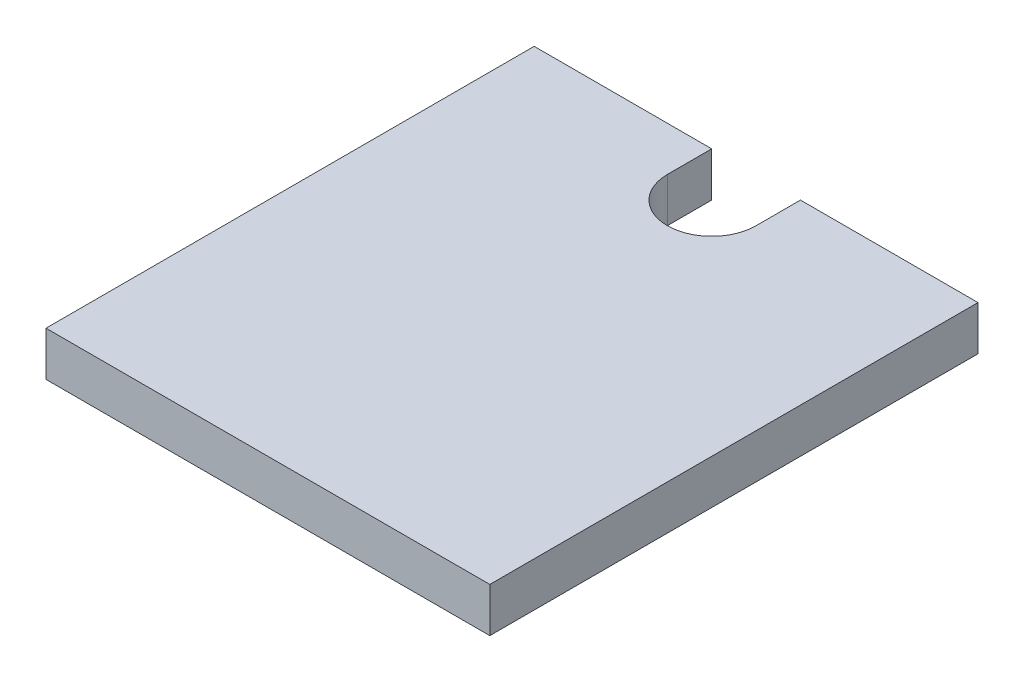
ISO-10303-21;
HEADER;
FILE_DESCRIPTION(('STEP AP214'),'2;1');
FILE_NAME('part.step','',(''),(''),'','','');
FILE_SCHEMA(('AUTOMOTIVE_DESIGN { 1 0 10303 214 1 1 1 1 }'));
ENDSEC;
DATA;
#1=APPLICATION_CONTEXT('core data for automotive mechanical design processes');
#2=APPLICATION_PROTOCOL_DEFINITION('international standard','automotive_design',2000,#1);
#3=PRODUCT_CONTEXT('',#1,'mechanical');
#4=PRODUCT('Part','Part','',(#3));
#5=PRODUCT_RELATED_PRODUCT_CATEGORY('part','',(#4));
#6=PRODUCT_DEFINITION_FORMATION('','',#4);
#7=PRODUCT_DEFINITION_CONTEXT('part definition',#1,'design');
#8=PRODUCT_DEFINITION('design','',#6,#7);
#9=PRODUCT_DEFINITION_SHAPE('','',#8);
#10=(LENGTH_UNIT() NAMED_UNIT(*) SI_UNIT(.MILLI.,.METRE.));
#11=(NAMED_UNIT(*) PLANE_ANGLE_UNIT() SI_UNIT($,.RADIAN.));
#12=(NAMED_UNIT(*) SI_UNIT($,.STERADIAN.) SOLID_ANGLE_UNIT());
#13=UNCERTAINTY_MEASURE_WITH_UNIT(LENGTH_MEASURE(1.E-05),#10,'distance_accuracy_value','');
#14=(GEOMETRIC_REPRESENTATION_CONTEXT(3) GLOBAL_UNCERTAINTY_ASSIGNED_CONTEXT((#13)) GLOBAL_UNIT_ASSIGNED_CONTEXT((#10,
#11,#12)) REPRESENTATION_CONTEXT('',''));
#15=CARTESIAN_POINT('',(0.,0.,0.));
#16=DIRECTION('',(0.,0.,1.));
#17=DIRECTION('',(1.,0.,0.));
#18=AXIS2_PLACEMENT_3D('',#15,#16,#17);
#19=CARTESIAN_POINT('',(25.,5.,-27.5));
#20=DIRECTION('',(-1.,0.,0.));
#21=DIRECTION('',(0.,0.,1.));
#22=AXIS2_PLACEMENT_3D('',#19,#20,#21);
#23=PLANE('',#22);
#24=DIRECTION('',(0.,0.,-1.));
#25=VECTOR('',#24,1.);
#26=CARTESIAN_POINT('',(25.,0.,-27.5));
#27=LINE('',#26,#25);
#28=CARTESIAN_POINT('',(25.,0.,27.5));
#29=VERTEX_POINT('',#28);
#30=CARTESIAN_POINT('',(25.,0.,-27.5));
#31=VERTEX_POINT('',#30);
#32=EDGE_CURVE('E129',#29,#31,#27,.T.);
#33=ORIENTED_EDGE('',*,*,#32,.T.);
#34=DIRECTION('',(0.,-1.,0.));
#35=VECTOR('',#34,1.);
#36=CARTESIAN_POINT('',(25.,5.,-27.5));
#37=LINE('',#36,#35);
#38=CARTESIAN_POINT('',(25.,5.,-27.5));
#39=VERTEX_POINT('',#38);
#40=EDGE_CURVE('E11',#39,#31,#37,.T.);
#41=ORIENTED_EDGE('',*,*,#40,.F.);
#42=DIRECTION('',(0.,0.,-1.));
#43=VECTOR('',#42,1.);
#44=CARTESIAN_POINT('',(25.,5.,-27.5));
#45=LINE('',#44,#43);
#46=CARTESIAN_POINT('',(25.,5.,27.5));
#47=VERTEX_POINT('',#46);
#48=EDGE_CURVE('E143',#47,#39,#45,.T.);
#49=ORIENTED_EDGE('',*,*,#48,.F.);
#50=DIRECTION('',(0.,-1.,0.));
#51=VECTOR('',#50,1.);
#52=CARTESIAN_POINT('',(25.,5.,27.5));
#53=LINE('',#52,#51);
#54=EDGE_CURVE('E125',#47,#29,#53,.T.);
#55=ORIENTED_EDGE('',*,*,#54,.T.);
#56=EDGE_LOOP('',(#33,#41,#49,#55));
#57=FACE_BOUND('',#56,.T.);
#58=ADVANCED_FACE('F33',(#57),#23,.F.);
#59=CARTESIAN_POINT('',(5.,5.,-27.5));
#60=DIRECTION('',(0.,0.,1.));
#61=DIRECTION('',(1.,0.,0.));
#62=AXIS2_PLACEMENT_3D('',#59,#60,#61);
#63=PLANE('',#62);
#64=DIRECTION('',(-1.,0.,0.));
#65=VECTOR('',#64,1.);
#66=CARTESIAN_POINT('',(5.,0.,-27.5));
#67=LINE('',#66,#65);
#68=CARTESIAN_POINT('',(5.,0.,-27.5));
#69=VERTEX_POINT('',#68);
#70=EDGE_CURVE('E132',#31,#69,#67,.T.);
#71=ORIENTED_EDGE('',*,*,#70,.T.);
#72=DIRECTION('',(0.,-1.,0.));
#73=VECTOR('',#72,1.);
#74=CARTESIAN_POINT('',(5.,5.,-27.5));
#75=LINE('',#74,#73);
#76=CARTESIAN_POINT('',(5.,5.,-27.5));
#77=VERTEX_POINT('',#76);
#78=EDGE_CURVE('E41',#77,#69,#75,.T.);
#79=ORIENTED_EDGE('',*,*,#78,.F.);
#80=DIRECTION('',(-1.,0.,0.));
#81=VECTOR('',#80,1.);
#82=CARTESIAN_POINT('',(5.,5.,-27.5));
#83=LINE('',#82,#81);
#84=EDGE_CURVE('E92',#39,#77,#83,.T.);
#85=ORIENTED_EDGE('',*,*,#84,.F.);
#86=ORIENTED_EDGE('',*,*,#40,.T.);
#87=EDGE_LOOP('',(#71,#79,#85,#86));
#88=FACE_BOUND('',#87,.T.);
#89=ADVANCED_FACE('F178',(#88),#63,.F.);
#90=CARTESIAN_POINT('',(5.,5.,-22.5));
#91=DIRECTION('',(1.,0.,0.));
#92=DIRECTION('',(0.,0.,-1.));
#93=AXIS2_PLACEMENT_3D('',#90,#91,#92);
#94=PLANE('',#93);
#95=DIRECTION('',(0.,0.,1.));
#96=VECTOR('',#95,1.);
#97=CARTESIAN_POINT('',(5.,0.,-22.5));
#98=LINE('',#97,#96);
#99=CARTESIAN_POINT('',(5.,0.,-22.5));
#100=VERTEX_POINT('',#99);
#101=EDGE_CURVE('E134',#69,#100,#98,.T.);
#102=ORIENTED_EDGE('',*,*,#101,.T.);
#103=DIRECTION('',(0.,-1.,0.));
#104=VECTOR('',#103,1.);
#105=CARTESIAN_POINT('',(5.,5.,-22.5));
#106=LINE('',#105,#104);
#107=CARTESIAN_POINT('',(5.,5.,-22.5));
#108=VERTEX_POINT('',#107);
#109=EDGE_CURVE('E150',#108,#100,#106,.T.);
#110=ORIENTED_EDGE('',*,*,#109,.F.);
#111=DIRECTION('',(0.,0.,1.));
#112=VECTOR('',#111,1.);
#113=CARTESIAN_POINT('',(5.,5.,-22.5));
#114=LINE('',#113,#112);
#115=EDGE_CURVE('E158',#77,#108,#114,.T.);
#116=ORIENTED_EDGE('',*,*,#115,.F.);
#117=ORIENTED_EDGE('',*,*,#78,.T.);
#118=EDGE_LOOP('',(#102,#110,#116,#117));
#119=FACE_BOUND('',#118,.T.);
#120=ADVANCED_FACE('F156',(#119),#94,.F.);
#121=CARTESIAN_POINT('',(0.,5.,-22.5));
#122=DIRECTION('',(0.,-1.,0.));
#123=DIRECTION('',(0.,0.,-1.));
#124=AXIS2_PLACEMENT_3D('',#121,#122,#123);
#125=CYLINDRICAL_SURFACE('',#124,5.);
#126=CARTESIAN_POINT('',(0.,0.,-22.5));
#127=DIRECTION('',(0.,-1.,0.));
#128=DIRECTION('',(0.,0.,-1.));
#129=AXIS2_PLACEMENT_3D('',#126,#127,#128);
#130=CIRCLE('',#129,5.);
#131=CARTESIAN_POINT('',(-5.,0.,-22.5));
#132=VERTEX_POINT('',#131);
#133=EDGE_CURVE('E136',#100,#132,#130,.T.);
#134=ORIENTED_EDGE('',*,*,#133,.T.);
#135=DIRECTION('',(0.,-1.,0.));
#136=VECTOR('',#135,1.);
#137=CARTESIAN_POINT('',(-5.,5.,-22.5));
#138=LINE('',#137,#136);
#139=CARTESIAN_POINT('',(-5.,5.,-22.5));
#140=VERTEX_POINT('',#139);
#141=EDGE_CURVE('E147',#140,#132,#138,.T.);
#142=ORIENTED_EDGE('',*,*,#141,.F.);
#143=CARTESIAN_POINT('',(0.,5.,-22.5));
#144=DIRECTION('',(0.,-1.,0.));
#145=DIRECTION('',(0.,0.,-1.));
#146=AXIS2_PLACEMENT_3D('',#143,#144,#145);
#147=CIRCLE('',#146,5.);
#148=EDGE_CURVE('E170',#108,#140,#147,.T.);
#149=ORIENTED_EDGE('',*,*,#148,.F.);
#150=ORIENTED_EDGE('',*,*,#109,.T.);
#151=EDGE_LOOP('',(#134,#142,#149,#150));
#152=FACE_BOUND('',#151,.T.);
#153=ADVANCED_FACE('F166',(#152),#125,.F.);
#154=CARTESIAN_POINT('',(-5.,5.,-22.5));
#155=DIRECTION('',(-1.,0.,0.));
#156=DIRECTION('',(0.,0.,1.));
#157=AXIS2_PLACEMENT_3D('',#154,#155,#156);
#158=PLANE('',#157);
#159=DIRECTION('',(0.,0.,-1.));
#160=VECTOR('',#159,1.);
#161=CARTESIAN_POINT('',(-5.,0.,-22.5));
#162=LINE('',#161,#160);
#163=CARTESIAN_POINT('',(-5.,0.,-27.5));
#164=VERTEX_POINT('',#163);
#165=EDGE_CURVE('E138',#132,#164,#162,.T.);
#166=ORIENTED_EDGE('',*,*,#165,.T.);
#167=DIRECTION('',(0.,-1.,0.));
#168=VECTOR('',#167,1.);
#169=CARTESIAN_POINT('',(-5.,5.,-27.5));
#170=LINE('',#169,#168);
#171=CARTESIAN_POINT('',(-5.,5.,-27.5));
#172=VERTEX_POINT('',#171);
#173=EDGE_CURVE('E120',#172,#164,#170,.T.);
#174=ORIENTED_EDGE('',*,*,#173,.F.);
#175=DIRECTION('',(0.,0.,-1.));
#176=VECTOR('',#175,1.);
#177=CARTESIAN_POINT('',(-5.,5.,-22.5));
#178=LINE('',#177,#176);
#179=EDGE_CURVE('E111',#140,#172,#178,.T.);
#180=ORIENTED_EDGE('',*,*,#179,.F.);
#181=ORIENTED_EDGE('',*,*,#141,.T.);
#182=EDGE_LOOP('',(#166,#174,#180,#181));
#183=FACE_BOUND('',#182,.T.);
#184=ADVANCED_FACE('F169',(#183),#158,.F.);
#185=CARTESIAN_POINT('',(-25.,5.,-27.5));
#186=DIRECTION('',(0.,0.,1.));
#187=DIRECTION('',(1.,0.,0.));
#188=AXIS2_PLACEMENT_3D('',#185,#186,#187);
#189=PLANE('',#188);
#190=DIRECTION('',(-1.,0.,0.));
#191=VECTOR('',#190,1.);
#192=CARTESIAN_POINT('',(-25.,0.,-27.5));
#193=LINE('',#192,#191);
#194=CARTESIAN_POINT('',(-25.,0.,-27.5));
#195=VERTEX_POINT('',#194);
#196=EDGE_CURVE('E119',#164,#195,#193,.T.);
#197=ORIENTED_EDGE('',*,*,#196,.T.);
#198=DIRECTION('',(0.,-1.,0.));
#199=VECTOR('',#198,1.);
#200=CARTESIAN_POINT('',(-25.,5.,-27.5));
#201=LINE('',#200,#199);
#202=CARTESIAN_POINT('',(-25.,5.,-27.5));
#203=VERTEX_POINT('',#202);
#204=EDGE_CURVE('E116',#203,#195,#201,.T.);
#205=ORIENTED_EDGE('',*,*,#204,.F.);
#206=DIRECTION('',(-1.,0.,0.));
#207=VECTOR('',#206,1.);
#208=CARTESIAN_POINT('',(-25.,5.,-27.5));
#209=LINE('',#208,#207);
#210=EDGE_CURVE('E105',#172,#203,#209,.T.);
#211=ORIENTED_EDGE('',*,*,#210,.F.);
#212=ORIENTED_EDGE('',*,*,#173,.T.);
#213=EDGE_LOOP('',(#197,#205,#211,#212));
#214=FACE_BOUND('',#213,.T.);
#215=ADVANCED_FACE('F117',(#214),#189,.F.);
#216=CARTESIAN_POINT('',(-25.,5.,-27.5));
#217=DIRECTION('',(1.,0.,0.));
#218=DIRECTION('',(0.,0.,-1.));
#219=AXIS2_PLACEMENT_3D('',#216,#217,#218);
#220=PLANE('',#219);
#221=DIRECTION('',(0.,0.,1.));
#222=VECTOR('',#221,1.);
#223=CARTESIAN_POINT('',(-25.,0.,-27.5));
#224=LINE('',#223,#222);
#225=CARTESIAN_POINT('',(-25.,0.,27.5));
#226=VERTEX_POINT('',#225);
#227=EDGE_CURVE('E78',#195,#226,#224,.T.);
#228=ORIENTED_EDGE('',*,*,#227,.T.);
#229=DIRECTION('',(0.,-1.,0.));
#230=VECTOR('',#229,1.);
#231=CARTESIAN_POINT('',(-25.,5.,27.5));
#232=LINE('',#231,#230);
#233=CARTESIAN_POINT('',(-25.,5.,27.5));
#234=VERTEX_POINT('',#233);
#235=EDGE_CURVE('E121',#234,#226,#232,.T.);
#236=ORIENTED_EDGE('',*,*,#235,.F.);
#237=DIRECTION('',(0.,0.,1.));
#238=VECTOR('',#237,1.);
#239=CARTESIAN_POINT('',(-25.,5.,-27.5));
#240=LINE('',#239,#238);
#241=EDGE_CURVE('E109',#203,#234,#240,.T.);
#242=ORIENTED_EDGE('',*,*,#241,.F.);
#243=ORIENTED_EDGE('',*,*,#204,.T.);
#244=EDGE_LOOP('',(#228,#236,#242,#243));
#245=FACE_BOUND('',#244,.T.);
#246=ADVANCED_FACE('F123',(#245),#220,.F.);
#247=CARTESIAN_POINT('',(-25.,5.,27.5));
#248=DIRECTION('',(0.,0.,-1.));
#249=DIRECTION('',(-1.,0.,0.));
#250=AXIS2_PLACEMENT_3D('',#247,#248,#249);
#251=PLANE('',#250);
#252=DIRECTION('',(1.,0.,0.));
#253=VECTOR('',#252,1.);
#254=CARTESIAN_POINT('',(-25.,0.,27.5));
#255=LINE('',#254,#253);
#256=EDGE_CURVE('E84',#226,#29,#255,.T.);
#257=ORIENTED_EDGE('',*,*,#256,.T.);
#258=ORIENTED_EDGE('',*,*,#54,.F.);
#259=DIRECTION('',(1.,0.,0.));
#260=VECTOR('',#259,1.);
#261=CARTESIAN_POINT('',(-25.,5.,27.5));
#262=LINE('',#261,#260);
#263=EDGE_CURVE('E49',#234,#47,#262,.T.);
#264=ORIENTED_EDGE('',*,*,#263,.F.);
#265=ORIENTED_EDGE('',*,*,#235,.T.);
#266=EDGE_LOOP('',(#257,#258,#264,#265));
#267=FACE_BOUND('',#266,.T.);
#268=ADVANCED_FACE('F194',(#267),#251,.F.);
#269=CARTESIAN_POINT('',(0.,5.,-22.5));
#270=DIRECTION('',(0.,-1.,0.));
#271=DIRECTION('',(0.,0.,-1.));
#272=AXIS2_PLACEMENT_3D('',#269,#270,#271);
#273=PLANE('',#272);
#274=ORIENTED_EDGE('',*,*,#48,.T.);
#275=ORIENTED_EDGE('',*,*,#84,.T.);
#276=ORIENTED_EDGE('',*,*,#115,.T.);
#277=ORIENTED_EDGE('',*,*,#148,.T.);
#278=ORIENTED_EDGE('',*,*,#179,.T.);
#279=ORIENTED_EDGE('',*,*,#210,.T.);
#280=ORIENTED_EDGE('',*,*,#241,.T.);
#281=ORIENTED_EDGE('',*,*,#263,.T.);
#282=EDGE_LOOP('',(#274,#275,#276,#277,#278,#279,#280,#281));
#283=FACE_BOUND('',#282,.T.);
#284=ADVANCED_FACE('F107',(#283),#273,.F.);
#285=CARTESIAN_POINT('',(0.,0.,-22.5));
#286=DIRECTION('',(0.,-1.,0.));
#287=DIRECTION('',(0.,0.,-1.));
#288=AXIS2_PLACEMENT_3D('',#285,#286,#287);
#289=PLANE('',#288);
#290=ORIENTED_EDGE('',*,*,#32,.F.);
#291=ORIENTED_EDGE('',*,*,#256,.F.);
#292=ORIENTED_EDGE('',*,*,#227,.F.);
#293=ORIENTED_EDGE('',*,*,#196,.F.);
#294=ORIENTED_EDGE('',*,*,#165,.F.);
#295=ORIENTED_EDGE('',*,*,#133,.F.);
#296=ORIENTED_EDGE('',*,*,#101,.F.);
#297=ORIENTED_EDGE('',*,*,#70,.F.);
#298=EDGE_LOOP('',(#290,#291,#292,#293,#294,#295,#296,#297));
#299=FACE_BOUND('',#298,.T.);
#300=ADVANCED_FACE('F162',(#299),#289,.T.);
#301=CLOSED_SHELL('',(#58,#89,#120,#153,#184,#215,#246,#268,#284,#300));
#302=MANIFOLD_SOLID_BREP('B2',#301);
#303=ADVANCED_BREP_SHAPE_REPRESENTATION('',(#18,#302),#14);
#304=SHAPE_DEFINITION_REPRESENTATION(#9,#303);
ENDSEC;
END-ISO-10303-21;
